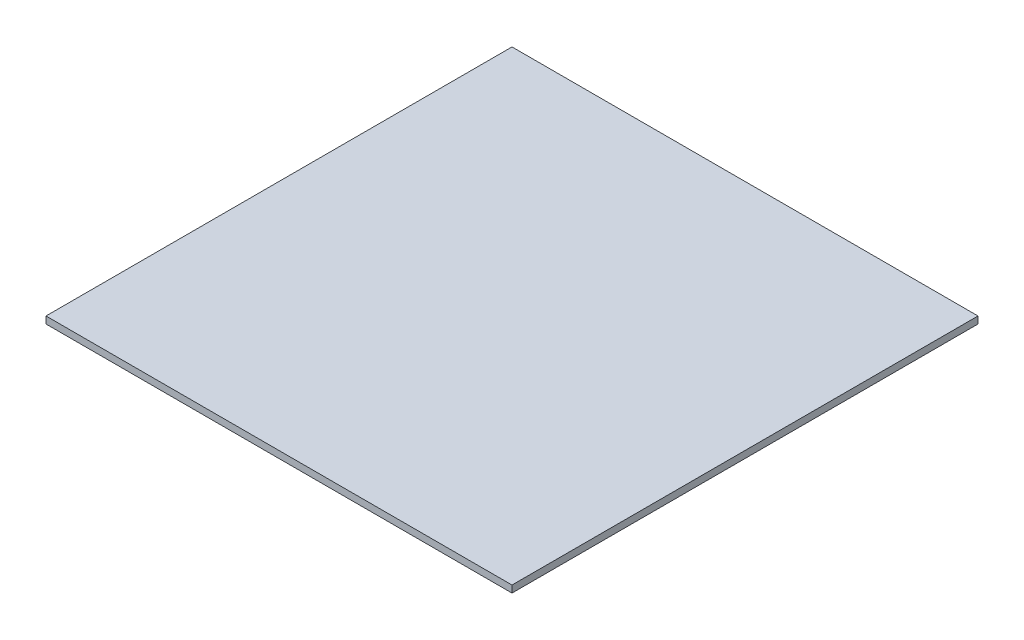
ISO-10303-21;
HEADER;
FILE_DESCRIPTION(('STEP AP214'),'2;1');
FILE_NAME('part.step','',(''),(''),'','','');
FILE_SCHEMA(('AUTOMOTIVE_DESIGN { 1 0 10303 214 1 1 1 1 }'));
ENDSEC;
DATA;
#1=APPLICATION_CONTEXT('core data for automotive mechanical design processes');
#2=APPLICATION_PROTOCOL_DEFINITION('international standard','automotive_design',2000,#1);
#3=PRODUCT_CONTEXT('',#1,'mechanical');
#4=PRODUCT('Part','Part','',(#3));
#5=PRODUCT_RELATED_PRODUCT_CATEGORY('part','',(#4));
#6=PRODUCT_DEFINITION_FORMATION('','',#4);
#7=PRODUCT_DEFINITION_CONTEXT('part definition',#1,'design');
#8=PRODUCT_DEFINITION('design','',#6,#7);
#9=PRODUCT_DEFINITION_SHAPE('','',#8);
#10=(LENGTH_UNIT() NAMED_UNIT(*) SI_UNIT(.MILLI.,.METRE.));
#11=(NAMED_UNIT(*) PLANE_ANGLE_UNIT() SI_UNIT($,.RADIAN.));
#12=(NAMED_UNIT(*) SI_UNIT($,.STERADIAN.) SOLID_ANGLE_UNIT());
#13=UNCERTAINTY_MEASURE_WITH_UNIT(LENGTH_MEASURE(1.E-05),#10,'distance_accuracy_value','');
#14=(GEOMETRIC_REPRESENTATION_CONTEXT(3) GLOBAL_UNCERTAINTY_ASSIGNED_CONTEXT((#13)) GLOBAL_UNIT_ASSIGNED_CONTEXT((#10,
#11,#12)) REPRESENTATION_CONTEXT('',''));
#15=CARTESIAN_POINT('',(0.,0.,0.));
#16=DIRECTION('',(0.,0.,1.));
#17=DIRECTION('',(1.,0.,0.));
#18=AXIS2_PLACEMENT_3D('',#15,#16,#17);
#19=CARTESIAN_POINT('',(2000.,60.,-2000.));
#20=DIRECTION('',(-1.,0.,0.));
#21=DIRECTION('',(0.,0.,1.));
#22=AXIS2_PLACEMENT_3D('',#19,#20,#21);
#23=PLANE('',#22);
#24=DIRECTION('',(0.,0.,-1.));
#25=VECTOR('',#24,1.);
#26=CARTESIAN_POINT('',(2000.,0.,-2000.));
#27=LINE('',#26,#25);
#28=CARTESIAN_POINT('',(2000.,0.,2000.));
#29=VERTEX_POINT('',#28);
#30=CARTESIAN_POINT('',(2000.,0.,-2000.));
#31=VERTEX_POINT('',#30);
#32=EDGE_CURVE('E95',#29,#31,#27,.T.);
#33=ORIENTED_EDGE('',*,*,#32,.T.);
#34=DIRECTION('',(0.,-1.,0.));
#35=VECTOR('',#34,1.);
#36=CARTESIAN_POINT('',(2000.,60.,-2000.));
#37=LINE('',#36,#35);
#38=CARTESIAN_POINT('',(2000.,60.,-2000.));
#39=VERTEX_POINT('',#38);
#40=EDGE_CURVE('E11',#39,#31,#37,.T.);
#41=ORIENTED_EDGE('',*,*,#40,.F.);
#42=DIRECTION('',(0.,0.,-1.));
#43=VECTOR('',#42,1.);
#44=CARTESIAN_POINT('',(2000.,60.,-2000.));
#45=LINE('',#44,#43);
#46=CARTESIAN_POINT('',(2000.,60.,2000.));
#47=VERTEX_POINT('',#46);
#48=EDGE_CURVE('E83',#47,#39,#45,.T.);
#49=ORIENTED_EDGE('',*,*,#48,.F.);
#50=DIRECTION('',(0.,-1.,0.));
#51=VECTOR('',#50,1.);
#52=CARTESIAN_POINT('',(2000.,60.,2000.));
#53=LINE('',#52,#51);
#54=EDGE_CURVE('E91',#47,#29,#53,.T.);
#55=ORIENTED_EDGE('',*,*,#54,.T.);
#56=EDGE_LOOP('',(#33,#41,#49,#55));
#57=FACE_BOUND('',#56,.T.);
#58=ADVANCED_FACE('F32',(#57),#23,.F.);
#59=CARTESIAN_POINT('',(-2000.,60.,-2000.));
#60=DIRECTION('',(0.,0.,1.));
#61=DIRECTION('',(1.,0.,0.));
#62=AXIS2_PLACEMENT_3D('',#59,#60,#61);
#63=PLANE('',#62);
#64=DIRECTION('',(-1.,0.,0.));
#65=VECTOR('',#64,1.);
#66=CARTESIAN_POINT('',(-2000.,0.,-2000.));
#67=LINE('',#66,#65);
#68=CARTESIAN_POINT('',(-2000.,0.,-2000.));
#69=VERTEX_POINT('',#68);
#70=EDGE_CURVE('E87',#31,#69,#67,.T.);
#71=ORIENTED_EDGE('',*,*,#70,.T.);
#72=DIRECTION('',(0.,-1.,0.));
#73=VECTOR('',#72,1.);
#74=CARTESIAN_POINT('',(-2000.,60.,-2000.));
#75=LINE('',#74,#73);
#76=CARTESIAN_POINT('',(-2000.,60.,-2000.));
#77=VERTEX_POINT('',#76);
#78=EDGE_CURVE('E40',#77,#69,#75,.T.);
#79=ORIENTED_EDGE('',*,*,#78,.F.);
#80=DIRECTION('',(-1.,0.,0.));
#81=VECTOR('',#80,1.);
#82=CARTESIAN_POINT('',(-2000.,60.,-2000.));
#83=LINE('',#82,#81);
#84=EDGE_CURVE('E78',#39,#77,#83,.T.);
#85=ORIENTED_EDGE('',*,*,#84,.F.);
#86=ORIENTED_EDGE('',*,*,#40,.T.);
#87=EDGE_LOOP('',(#71,#79,#85,#86));
#88=FACE_BOUND('',#87,.T.);
#89=ADVANCED_FACE('F86',(#88),#63,.F.);
#90=CARTESIAN_POINT('',(-2000.,60.,-2000.));
#91=DIRECTION('',(1.,0.,0.));
#92=DIRECTION('',(0.,0.,-1.));
#93=AXIS2_PLACEMENT_3D('',#90,#91,#92);
#94=PLANE('',#93);
#95=DIRECTION('',(0.,0.,1.));
#96=VECTOR('',#95,1.);
#97=CARTESIAN_POINT('',(-2000.,0.,-2000.));
#98=LINE('',#97,#96);
#99=CARTESIAN_POINT('',(-2000.,0.,2000.));
#100=VERTEX_POINT('',#99);
#101=EDGE_CURVE('E65',#69,#100,#98,.T.);
#102=ORIENTED_EDGE('',*,*,#101,.T.);
#103=DIRECTION('',(0.,-1.,0.));
#104=VECTOR('',#103,1.);
#105=CARTESIAN_POINT('',(-2000.,60.,2000.));
#106=LINE('',#105,#104);
#107=CARTESIAN_POINT('',(-2000.,60.,2000.));
#108=VERTEX_POINT('',#107);
#109=EDGE_CURVE('E88',#108,#100,#106,.T.);
#110=ORIENTED_EDGE('',*,*,#109,.F.);
#111=DIRECTION('',(0.,0.,1.));
#112=VECTOR('',#111,1.);
#113=CARTESIAN_POINT('',(-2000.,60.,-2000.));
#114=LINE('',#113,#112);
#115=EDGE_CURVE('E81',#77,#108,#114,.T.);
#116=ORIENTED_EDGE('',*,*,#115,.F.);
#117=ORIENTED_EDGE('',*,*,#78,.T.);
#118=EDGE_LOOP('',(#102,#110,#116,#117));
#119=FACE_BOUND('',#118,.T.);
#120=ADVANCED_FACE('F89',(#119),#94,.F.);
#121=CARTESIAN_POINT('',(-2000.,60.,2000.));
#122=DIRECTION('',(0.,0.,-1.));
#123=DIRECTION('',(-1.,0.,0.));
#124=AXIS2_PLACEMENT_3D('',#121,#122,#123);
#125=PLANE('',#124);
#126=DIRECTION('',(1.,0.,0.));
#127=VECTOR('',#126,1.);
#128=CARTESIAN_POINT('',(-2000.,0.,2000.));
#129=LINE('',#128,#127);
#130=EDGE_CURVE('E71',#100,#29,#129,.T.);
#131=ORIENTED_EDGE('',*,*,#130,.T.);
#132=ORIENTED_EDGE('',*,*,#54,.F.);
#133=DIRECTION('',(1.,0.,0.));
#134=VECTOR('',#133,1.);
#135=CARTESIAN_POINT('',(-2000.,60.,2000.));
#136=LINE('',#135,#134);
#137=EDGE_CURVE('E48',#108,#47,#136,.T.);
#138=ORIENTED_EDGE('',*,*,#137,.F.);
#139=ORIENTED_EDGE('',*,*,#109,.T.);
#140=EDGE_LOOP('',(#131,#132,#138,#139));
#141=FACE_BOUND('',#140,.T.);
#142=ADVANCED_FACE('F102',(#141),#125,.F.);
#143=CARTESIAN_POINT('',(0.,60.,0.));
#144=DIRECTION('',(0.,1.,0.));
#145=DIRECTION('',(0.,0.,1.));
#146=AXIS2_PLACEMENT_3D('',#143,#144,#145);
#147=PLANE('',#146);
#148=ORIENTED_EDGE('',*,*,#48,.T.);
#149=ORIENTED_EDGE('',*,*,#84,.T.);
#150=ORIENTED_EDGE('',*,*,#115,.T.);
#151=ORIENTED_EDGE('',*,*,#137,.T.);
#152=EDGE_LOOP('',(#148,#149,#150,#151));
#153=FACE_BOUND('',#152,.T.);
#154=ADVANCED_FACE('F79',(#153),#147,.T.);
#155=CARTESIAN_POINT('',(0.,0.,0.));
#156=DIRECTION('',(0.,1.,0.));
#157=DIRECTION('',(0.,0.,1.));
#158=AXIS2_PLACEMENT_3D('',#155,#156,#157);
#159=PLANE('',#158);
#160=ORIENTED_EDGE('',*,*,#32,.F.);
#161=ORIENTED_EDGE('',*,*,#130,.F.);
#162=ORIENTED_EDGE('',*,*,#101,.F.);
#163=ORIENTED_EDGE('',*,*,#70,.F.);
#164=EDGE_LOOP('',(#160,#161,#162,#163));
#165=FACE_BOUND('',#164,.T.);
#166=ADVANCED_FACE('F105',(#165),#159,.F.);
#167=CLOSED_SHELL('',(#58,#89,#120,#142,#154,#166));
#168=MANIFOLD_SOLID_BREP('B2',#167);
#169=ADVANCED_BREP_SHAPE_REPRESENTATION('',(#18,#168),#14);
#170=SHAPE_DEFINITION_REPRESENTATION(#9,#169);
ENDSEC;
END-ISO-10303-21;
